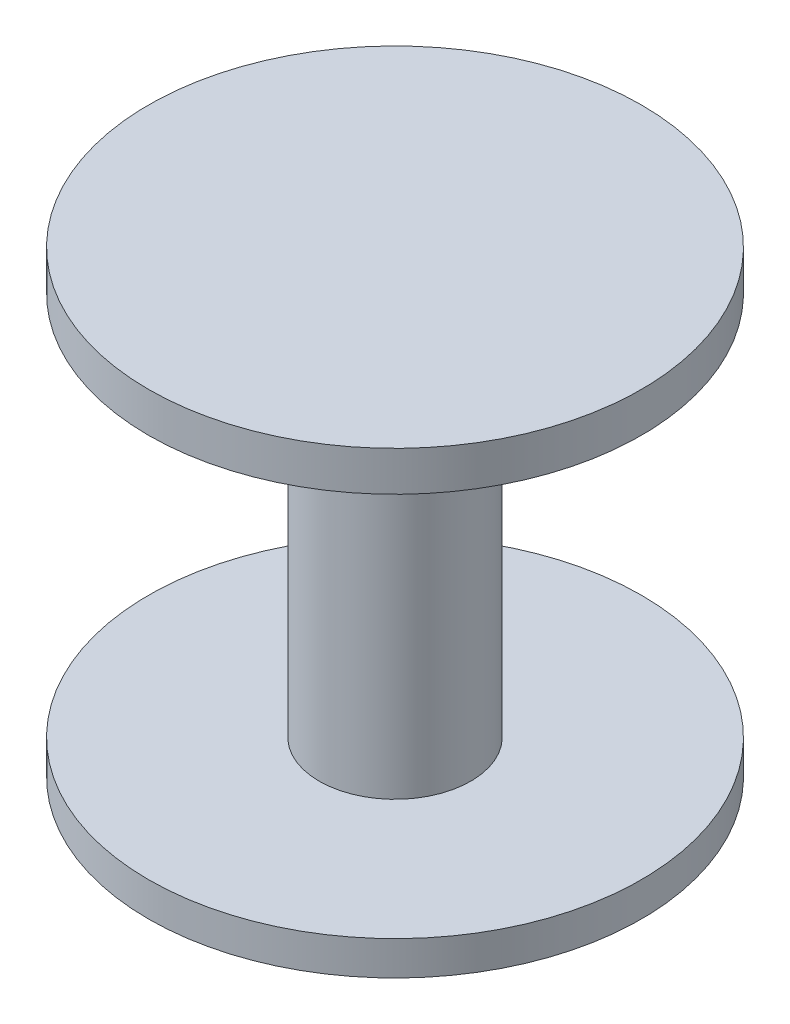
ISO-10303-21;
HEADER;
FILE_DESCRIPTION(('STEP AP214'),'2;1');
FILE_NAME('part.step','',(''),(''),'','','');
FILE_SCHEMA(('AUTOMOTIVE_DESIGN { 1 0 10303 214 1 1 1 1 }'));
ENDSEC;
DATA;
#1=APPLICATION_CONTEXT('core data for automotive mechanical design processes');
#2=APPLICATION_PROTOCOL_DEFINITION('international standard','automotive_design',2000,#1);
#3=PRODUCT_CONTEXT('',#1,'mechanical');
#4=PRODUCT('Part','Part','',(#3));
#5=PRODUCT_RELATED_PRODUCT_CATEGORY('part','',(#4));
#6=PRODUCT_DEFINITION_FORMATION('','',#4);
#7=PRODUCT_DEFINITION_CONTEXT('part definition',#1,'design');
#8=PRODUCT_DEFINITION('design','',#6,#7);
#9=PRODUCT_DEFINITION_SHAPE('','',#8);
#10=(LENGTH_UNIT() NAMED_UNIT(*) SI_UNIT(.MILLI.,.METRE.));
#11=(NAMED_UNIT(*) PLANE_ANGLE_UNIT() SI_UNIT($,.RADIAN.));
#12=(NAMED_UNIT(*) SI_UNIT($,.STERADIAN.) SOLID_ANGLE_UNIT());
#13=UNCERTAINTY_MEASURE_WITH_UNIT(LENGTH_MEASURE(1.E-05),#10,'distance_accuracy_value','');
#14=(GEOMETRIC_REPRESENTATION_CONTEXT(3) GLOBAL_UNCERTAINTY_ASSIGNED_CONTEXT((#13)) GLOBAL_UNIT_ASSIGNED_CONTEXT((#10,
#11,#12)) REPRESENTATION_CONTEXT('',''));
#15=CARTESIAN_POINT('',(0.,0.,0.));
#16=DIRECTION('',(0.,0.,1.));
#17=DIRECTION('',(1.,0.,0.));
#18=AXIS2_PLACEMENT_3D('',#15,#16,#17);
#19=CARTESIAN_POINT('',(0.,0.9,0.));
#20=DIRECTION('',(0.,1.,0.));
#21=DIRECTION('',(0.,0.,1.));
#22=AXIS2_PLACEMENT_3D('',#19,#20,#21);
#23=PLANE('',#22);
#24=CARTESIAN_POINT('',(0.,0.9,0.));
#25=DIRECTION('',(0.,1.,0.));
#26=DIRECTION('',(0.,0.,1.));
#27=AXIS2_PLACEMENT_3D('',#24,#25,#26);
#28=CIRCLE('',#27,6.5);
#29=CARTESIAN_POINT('',(0.,0.9,6.5));
#30=VERTEX_POINT('',#29);
#31=EDGE_CURVE('E11',#30,#30,#28,.T.);
#32=ORIENTED_EDGE('',*,*,#31,.T.);
#33=EDGE_LOOP('',(#32));
#34=FACE_BOUND('',#33,.T.);
#35=CARTESIAN_POINT('',(0.,0.9,0.));
#36=DIRECTION('',(0.,1.,0.));
#37=DIRECTION('',(0.,0.,1.));
#38=AXIS2_PLACEMENT_3D('',#35,#36,#37);
#39=CIRCLE('',#38,2.);
#40=CARTESIAN_POINT('',(0.,0.9,2.));
#41=VERTEX_POINT('',#40);
#42=EDGE_CURVE('E67',#41,#41,#39,.T.);
#43=ORIENTED_EDGE('',*,*,#42,.F.);
#44=EDGE_LOOP('',(#43));
#45=FACE_BOUND('',#44,.T.);
#46=ADVANCED_FACE('F37',(#34,#45),#23,.T.);
#47=CARTESIAN_POINT('',(0.,0.9,0.));
#48=DIRECTION('',(0.,-1.,0.));
#49=DIRECTION('',(0.,0.,-1.));
#50=AXIS2_PLACEMENT_3D('',#47,#48,#49);
#51=CYLINDRICAL_SURFACE('',#50,6.5);
#52=ORIENTED_EDGE('',*,*,#31,.F.);
#53=EDGE_LOOP('',(#52));
#54=FACE_BOUND('',#53,.T.);
#55=CARTESIAN_POINT('',(0.,0.,0.));
#56=DIRECTION('',(0.,1.,0.));
#57=DIRECTION('',(0.,0.,1.));
#58=AXIS2_PLACEMENT_3D('',#55,#56,#57);
#59=CIRCLE('',#58,6.5);
#60=CARTESIAN_POINT('',(0.,0.,6.5));
#61=VERTEX_POINT('',#60);
#62=EDGE_CURVE('E41',#61,#61,#59,.T.);
#63=ORIENTED_EDGE('',*,*,#62,.T.);
#64=EDGE_LOOP('',(#63));
#65=FACE_BOUND('',#64,.T.);
#66=ADVANCED_FACE('F39',(#54,#65),#51,.T.);
#67=CARTESIAN_POINT('',(0.,0.,0.));
#68=DIRECTION('',(0.,1.,0.));
#69=DIRECTION('',(0.,0.,1.));
#70=AXIS2_PLACEMENT_3D('',#67,#68,#69);
#71=PLANE('',#70);
#72=CARTESIAN_POINT('',(0.,0.,0.));
#73=DIRECTION('',(0.,-1.,0.));
#74=DIRECTION('',(0.,0.,-1.));
#75=AXIS2_PLACEMENT_3D('',#72,#73,#74);
#76=CIRCLE('',#75,0.79999999999999);
#77=CARTESIAN_POINT('',(0.,0.,-0.79999999999999));
#78=VERTEX_POINT('',#77);
#79=EDGE_CURVE('E58',#78,#78,#76,.T.);
#80=ORIENTED_EDGE('',*,*,#79,.F.);
#81=EDGE_LOOP('',(#80));
#82=FACE_BOUND('',#81,.T.);
#83=ORIENTED_EDGE('',*,*,#62,.F.);
#84=EDGE_LOOP('',(#83));
#85=FACE_BOUND('',#84,.T.);
#86=ADVANCED_FACE('F83',(#82,#85),#71,.F.);
#87=CARTESIAN_POINT('',(0.,11.05,0.));
#88=DIRECTION('',(0.,-1.,0.));
#89=DIRECTION('',(0.,0.,-1.));
#90=AXIS2_PLACEMENT_3D('',#87,#88,#89);
#91=CYLINDRICAL_SURFACE('',#90,2.);
#92=CARTESIAN_POINT('',(0.,11.05,0.));
#93=DIRECTION('',(0.,1.,0.));
#94=DIRECTION('',(0.,0.,1.));
#95=AXIS2_PLACEMENT_3D('',#92,#93,#94);
#96=CIRCLE('',#95,2.);
#97=CARTESIAN_POINT('',(0.,11.05,2.));
#98=VERTEX_POINT('',#97);
#99=EDGE_CURVE('E69',#98,#98,#96,.T.);
#100=ORIENTED_EDGE('',*,*,#99,.F.);
#101=EDGE_LOOP('',(#100));
#102=FACE_BOUND('',#101,.T.);
#103=ORIENTED_EDGE('',*,*,#42,.T.);
#104=EDGE_LOOP('',(#103));
#105=FACE_BOUND('',#104,.T.);
#106=ADVANCED_FACE('F75',(#102,#105),#91,.T.);
#107=CARTESIAN_POINT('',(0.,11.05,0.));
#108=DIRECTION('',(0.,1.,0.));
#109=DIRECTION('',(0.,0.,1.));
#110=AXIS2_PLACEMENT_3D('',#107,#108,#109);
#111=PLANE('',#110);
#112=CARTESIAN_POINT('',(0.,11.05,0.));
#113=DIRECTION('',(0.,1.,0.));
#114=DIRECTION('',(0.,0.,1.));
#115=AXIS2_PLACEMENT_3D('',#112,#113,#114);
#116=CIRCLE('',#115,6.5);
#117=CARTESIAN_POINT('',(0.,11.05,6.5));
#118=VERTEX_POINT('',#117);
#119=EDGE_CURVE('E57',#118,#118,#116,.T.);
#120=ORIENTED_EDGE('',*,*,#119,.F.);
#121=EDGE_LOOP('',(#120));
#122=FACE_BOUND('',#121,.T.);
#123=ORIENTED_EDGE('',*,*,#99,.T.);
#124=EDGE_LOOP('',(#123));
#125=FACE_BOUND('',#124,.T.);
#126=ADVANCED_FACE('F92',(#122,#125),#111,.F.);
#127=CARTESIAN_POINT('',(0.,12.1,0.));
#128=DIRECTION('',(0.,-1.,0.));
#129=DIRECTION('',(0.,0.,-1.));
#130=AXIS2_PLACEMENT_3D('',#127,#128,#129);
#131=CYLINDRICAL_SURFACE('',#130,6.5);
#132=CARTESIAN_POINT('',(0.,12.1,0.));
#133=DIRECTION('',(0.,1.,0.));
#134=DIRECTION('',(0.,0.,1.));
#135=AXIS2_PLACEMENT_3D('',#132,#133,#134);
#136=CIRCLE('',#135,6.5);
#137=CARTESIAN_POINT('',(0.,12.1,6.5));
#138=VERTEX_POINT('',#137);
#139=EDGE_CURVE('E61',#138,#138,#136,.T.);
#140=ORIENTED_EDGE('',*,*,#139,.F.);
#141=EDGE_LOOP('',(#140));
#142=FACE_BOUND('',#141,.T.);
#143=ORIENTED_EDGE('',*,*,#119,.T.);
#144=EDGE_LOOP('',(#143));
#145=FACE_BOUND('',#144,.T.);
#146=ADVANCED_FACE('F107',(#142,#145),#131,.T.);
#147=CARTESIAN_POINT('',(0.,12.1,0.));
#148=DIRECTION('',(0.,1.,0.));
#149=DIRECTION('',(0.,0.,1.));
#150=AXIS2_PLACEMENT_3D('',#147,#148,#149);
#151=PLANE('',#150);
#152=ORIENTED_EDGE('',*,*,#139,.T.);
#153=EDGE_LOOP('',(#152));
#154=FACE_BOUND('',#153,.T.);
#155=ADVANCED_FACE('F51',(#154),#151,.T.);
#156=CARTESIAN_POINT('',(0.,5.2,0.));
#157=DIRECTION('',(0.,-1.,0.));
#158=DIRECTION('',(0.,0.,-1.));
#159=AXIS2_PLACEMENT_3D('',#156,#157,#158);
#160=CONICAL_SURFACE('',#159,0.799999999999988,1.02974425867664);
#161=CARTESIAN_POINT('',(0.,5.68068849522205,0.));
#162=VERTEX_POINT('',#161);
#163=VERTEX_LOOP('',#162);
#164=FACE_BOUND('',#163,.T.);
#165=CARTESIAN_POINT('',(0.,5.2,0.));
#166=DIRECTION('',(0.,-1.,0.));
#167=DIRECTION('',(0.,0.,-1.));
#168=AXIS2_PLACEMENT_3D('',#165,#166,#167);
#169=CIRCLE('',#168,0.799999999999988);
#170=CARTESIAN_POINT('',(0.,5.2,-0.799999999999988));
#171=VERTEX_POINT('',#170);
#172=EDGE_CURVE('E55',#171,#171,#169,.T.);
#173=ORIENTED_EDGE('',*,*,#172,.T.);
#174=EDGE_LOOP('',(#173));
#175=FACE_BOUND('',#174,.T.);
#176=ADVANCED_FACE('F47',(#164,#175),#160,.F.);
#177=CARTESIAN_POINT('',(0.,0.,0.));
#178=DIRECTION('',(0.,-1.,0.));
#179=DIRECTION('',(0.,0.,-1.));
#180=AXIS2_PLACEMENT_3D('',#177,#178,#179);
#181=CYLINDRICAL_SURFACE('',#180,0.799999999999989);
#182=ORIENTED_EDGE('',*,*,#172,.F.);
#183=EDGE_LOOP('',(#182));
#184=FACE_BOUND('',#183,.T.);
#185=ORIENTED_EDGE('',*,*,#79,.T.);
#186=EDGE_LOOP('',(#185));
#187=FACE_BOUND('',#186,.T.);
#188=ADVANCED_FACE('F50',(#184,#187),#181,.F.);
#189=CLOSED_SHELL('',(#46,#66,#86,#106,#126,#146,#155,#176,#188));
#190=MANIFOLD_SOLID_BREP('B2',#189);
#191=ADVANCED_BREP_SHAPE_REPRESENTATION('',(#18,#190),#14);
#192=SHAPE_DEFINITION_REPRESENTATION(#9,#191);
ENDSEC;
END-ISO-10303-21;
